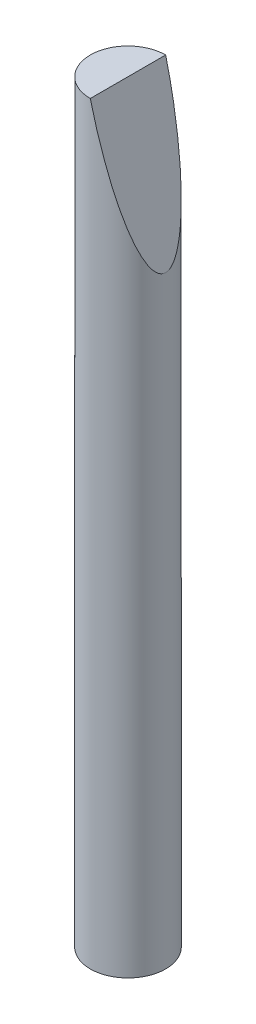
ISO-10303-21;
HEADER;
FILE_DESCRIPTION(('STEP AP214'),'2;1');
FILE_NAME('part.step','',(''),(''),'','','');
FILE_SCHEMA(('AUTOMOTIVE_DESIGN { 1 0 10303 214 1 1 1 1 }'));
ENDSEC;
DATA;
#1=APPLICATION_CONTEXT('core data for automotive mechanical design processes');
#2=APPLICATION_PROTOCOL_DEFINITION('international standard','automotive_design',2000,#1);
#3=PRODUCT_CONTEXT('',#1,'mechanical');
#4=PRODUCT('Part','Part','',(#3));
#5=PRODUCT_RELATED_PRODUCT_CATEGORY('part','',(#4));
#6=PRODUCT_DEFINITION_FORMATION('','',#4);
#7=PRODUCT_DEFINITION_CONTEXT('part definition',#1,'design');
#8=PRODUCT_DEFINITION('design','',#6,#7);
#9=PRODUCT_DEFINITION_SHAPE('','',#8);
#10=(LENGTH_UNIT() NAMED_UNIT(*) SI_UNIT(.MILLI.,.METRE.));
#11=(NAMED_UNIT(*) PLANE_ANGLE_UNIT() SI_UNIT($,.RADIAN.));
#12=(NAMED_UNIT(*) SI_UNIT($,.STERADIAN.) SOLID_ANGLE_UNIT());
#13=UNCERTAINTY_MEASURE_WITH_UNIT(LENGTH_MEASURE(1.E-05),#10,'distance_accuracy_value','');
#14=(GEOMETRIC_REPRESENTATION_CONTEXT(3) GLOBAL_UNCERTAINTY_ASSIGNED_CONTEXT((#13)) GLOBAL_UNIT_ASSIGNED_CONTEXT((#10,
#11,#12)) REPRESENTATION_CONTEXT('',''));
#15=CARTESIAN_POINT('',(0.,0.,0.));
#16=DIRECTION('',(0.,0.,1.));
#17=DIRECTION('',(1.,0.,0.));
#18=AXIS2_PLACEMENT_3D('',#15,#16,#17);
#19=CARTESIAN_POINT('',(0.,20.,0.));
#20=DIRECTION('',(0.,-1.,0.));
#21=DIRECTION('',(0.,0.,-1.));
#22=AXIS2_PLACEMENT_3D('',#19,#20,#21);
#23=CYLINDRICAL_SURFACE('',#22,1.);
#24=CARTESIAN_POINT('',(0.,0.,0.));
#25=DIRECTION('',(0.,1.,0.));
#26=DIRECTION('',(0.,0.,1.));
#27=AXIS2_PLACEMENT_3D('',#24,#25,#26);
#28=CIRCLE('',#27,1.);
#29=CARTESIAN_POINT('',(0.,0.,1.));
#30=VERTEX_POINT('',#29);
#31=EDGE_CURVE('E42',#30,#30,#28,.T.);
#32=ORIENTED_EDGE('',*,*,#31,.T.);
#33=EDGE_LOOP('',(#32));
#34=FACE_BOUND('',#33,.T.);
#35=CARTESIAN_POINT('',(0.,20.,0.));
#36=DIRECTION('',(0.970142500145332,0.242535625036333,0.));
#37=DIRECTION('',(0.242535625036333,-0.970142500145332,0.));
#38=AXIS2_PLACEMENT_3D('',#35,#36,#37);
#39=ELLIPSE('',#38,4.12310562561766,1.);
#40=CARTESIAN_POINT('',(0.,20.,1.));
#41=VERTEX_POINT('',#40);
#42=CARTESIAN_POINT('',(0.,20.,-1.));
#43=VERTEX_POINT('',#42);
#44=EDGE_CURVE('E53',#41,#43,#39,.T.);
#45=ORIENTED_EDGE('',*,*,#44,.F.);
#46=CARTESIAN_POINT('',(0.,20.,0.));
#47=DIRECTION('',(0.,1.,0.));
#48=DIRECTION('',(0.,0.,1.));
#49=AXIS2_PLACEMENT_3D('',#46,#47,#48);
#50=CIRCLE('',#49,1.);
#51=EDGE_CURVE('E11',#43,#41,#50,.T.);
#52=ORIENTED_EDGE('',*,*,#51,.F.);
#53=EDGE_LOOP('',(#45,#52));
#54=FACE_BOUND('',#53,.T.);
#55=ADVANCED_FACE('F39',(#34,#54),#23,.T.);
#56=CARTESIAN_POINT('',(0.,20.,0.));
#57=DIRECTION('',(0.,1.,0.));
#58=DIRECTION('',(0.,0.,1.));
#59=AXIS2_PLACEMENT_3D('',#56,#57,#58);
#60=PLANE('',#59);
#61=ORIENTED_EDGE('',*,*,#51,.T.);
#62=DIRECTION('',(0.,0.,1.));
#63=VECTOR('',#62,1.);
#64=CARTESIAN_POINT('',(0.,20.,-1.));
#65=LINE('',#64,#63);
#66=EDGE_CURVE('E58',#43,#41,#65,.T.);
#67=ORIENTED_EDGE('',*,*,#66,.F.);
#68=EDGE_LOOP('',(#61,#67));
#69=FACE_BOUND('',#68,.T.);
#70=ADVANCED_FACE('F64',(#69),#60,.T.);
#71=CARTESIAN_POINT('',(0.,0.,0.));
#72=DIRECTION('',(0.,1.,0.));
#73=DIRECTION('',(0.,0.,1.));
#74=AXIS2_PLACEMENT_3D('',#71,#72,#73);
#75=PLANE('',#74);
#76=ORIENTED_EDGE('',*,*,#31,.F.);
#77=EDGE_LOOP('',(#76));
#78=FACE_BOUND('',#77,.T.);
#79=ADVANCED_FACE('F66',(#78),#75,.F.);
#80=CARTESIAN_POINT('',(1.,16.,-1.));
#81=DIRECTION('',(0.970142500145332,0.242535625036333,0.));
#82=DIRECTION('',(-0.242535625036333,0.970142500145332,0.));
#83=AXIS2_PLACEMENT_3D('',#80,#81,#82);
#84=PLANE('',#83);
#85=ORIENTED_EDGE('',*,*,#44,.T.);
#86=ORIENTED_EDGE('',*,*,#66,.T.);
#87=EDGE_LOOP('',(#85,#86));
#88=FACE_BOUND('',#87,.T.);
#89=ADVANCED_FACE('F60',(#88),#84,.T.);
#90=CLOSED_SHELL('',(#55,#70,#79,#89));
#91=MANIFOLD_SOLID_BREP('B2',#90);
#92=ADVANCED_BREP_SHAPE_REPRESENTATION('',(#18,#91),#14);
#93=SHAPE_DEFINITION_REPRESENTATION(#9,#92);
ENDSEC;
END-ISO-10303-21;
